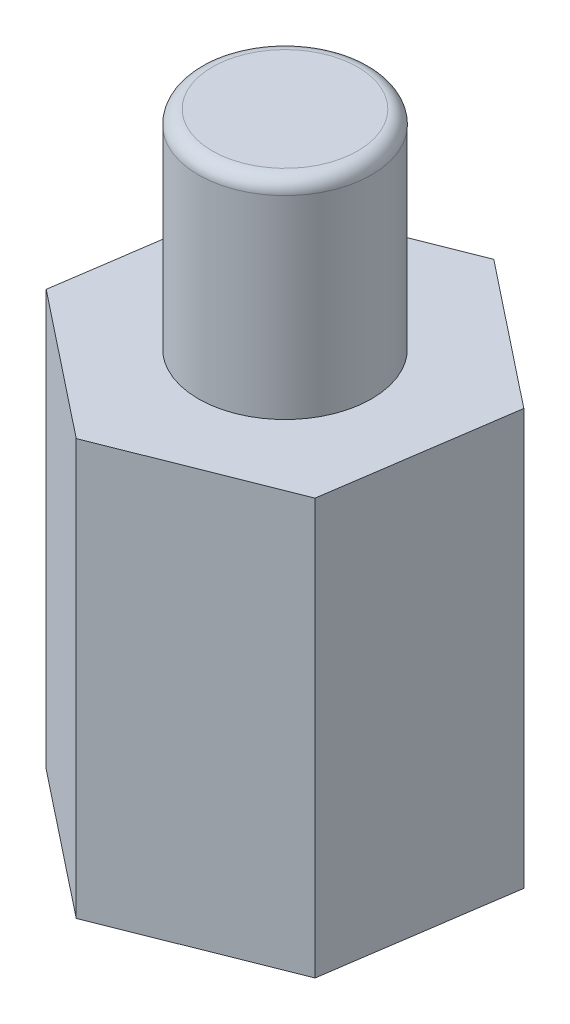
ISO-10303-21;
HEADER;
FILE_DESCRIPTION(('STEP AP214'),'2;1');
FILE_NAME('part.step','',(''),(''),'','','');
FILE_SCHEMA(('AUTOMOTIVE_DESIGN { 1 0 10303 214 1 1 1 1 }'));
ENDSEC;
DATA;
#1=APPLICATION_CONTEXT('core data for automotive mechanical design processes');
#2=APPLICATION_PROTOCOL_DEFINITION('international standard','automotive_design',2000,#1);
#3=PRODUCT_CONTEXT('',#1,'mechanical');
#4=PRODUCT('Part','Part','',(#3));
#5=PRODUCT_RELATED_PRODUCT_CATEGORY('part','',(#4));
#6=PRODUCT_DEFINITION_FORMATION('','',#4);
#7=PRODUCT_DEFINITION_CONTEXT('part definition',#1,'design');
#8=PRODUCT_DEFINITION('design','',#6,#7);
#9=PRODUCT_DEFINITION_SHAPE('','',#8);
#10=(LENGTH_UNIT() NAMED_UNIT(*) SI_UNIT(.MILLI.,.METRE.));
#11=(NAMED_UNIT(*) PLANE_ANGLE_UNIT() SI_UNIT($,.RADIAN.));
#12=(NAMED_UNIT(*) SI_UNIT($,.STERADIAN.) SOLID_ANGLE_UNIT());
#13=UNCERTAINTY_MEASURE_WITH_UNIT(LENGTH_MEASURE(1.E-05),#10,'distance_accuracy_value','');
#14=(GEOMETRIC_REPRESENTATION_CONTEXT(3) GLOBAL_UNCERTAINTY_ASSIGNED_CONTEXT((#13)) GLOBAL_UNIT_ASSIGNED_CONTEXT((#10,
#11,#12)) REPRESENTATION_CONTEXT('',''));
#15=CARTESIAN_POINT('',(0.,0.,0.));
#16=DIRECTION('',(0.,0.,1.));
#17=DIRECTION('',(1.,0.,0.));
#18=AXIS2_PLACEMENT_3D('',#15,#16,#17);
#19=CARTESIAN_POINT('',(-0.386477916077778,6.,2.62754032389945));
#20=DIRECTION('',(-0.368652129532225,0.,-0.929567430255253));
#21=DIRECTION('',(-0.929567430255254,0.,0.368652129532225));
#22=AXIS2_PLACEMENT_3D('',#19,#20,#21);
#23=PLANE('',#22);
#24=DIRECTION('',(0.929567430255254,0.,-0.368652129532225));
#25=VECTOR('',#24,1.);
#26=CARTESIAN_POINT('',(-0.386477916077778,0.,2.62754032389945));
#27=LINE('',#26,#25);
#28=CARTESIAN_POINT('',(-0.386477916077778,0.,2.62754032389945));
#29=VERTEX_POINT('',#28);
#30=CARTESIAN_POINT('',(2.08227771192603,0.,1.64846985527475));
#31=VERTEX_POINT('',#30);
#32=EDGE_CURVE('E119',#29,#31,#27,.T.);
#33=ORIENTED_EDGE('',*,*,#32,.T.);
#34=DIRECTION('',(0.,-1.,0.));
#35=VECTOR('',#34,1.);
#36=CARTESIAN_POINT('',(2.08227771192603,6.,1.64846985527475));
#37=LINE('',#36,#35);
#38=CARTESIAN_POINT('',(2.08227771192603,6.,1.64846985527475));
#39=VERTEX_POINT('',#38);
#40=EDGE_CURVE('E137',#39,#31,#37,.T.);
#41=ORIENTED_EDGE('',*,*,#40,.F.);
#42=DIRECTION('',(0.929567430255254,0.,-0.368652129532225));
#43=VECTOR('',#42,1.);
#44=CARTESIAN_POINT('',(-0.386477916077778,6.,2.62754032389945));
#45=LINE('',#44,#43);
#46=CARTESIAN_POINT('',(-0.386477916077778,6.,2.62754032389945));
#47=VERTEX_POINT('',#46);
#48=EDGE_CURVE('E130',#47,#39,#45,.T.);
#49=ORIENTED_EDGE('',*,*,#48,.F.);
#50=DIRECTION('',(0.,-1.,0.));
#51=VECTOR('',#50,1.);
#52=CARTESIAN_POINT('',(-0.386477916077778,6.,2.62754032389945));
#53=LINE('',#52,#51);
#54=EDGE_CURVE('E115',#47,#29,#53,.T.);
#55=ORIENTED_EDGE('',*,*,#54,.T.);
#56=EDGE_LOOP('',(#33,#41,#49,#55));
#57=FACE_BOUND('',#56,.T.);
#58=ADVANCED_FACE('F33',(#57),#23,.F.);
#59=CARTESIAN_POINT('',(2.08227771192603,6.,1.64846985527475));
#60=DIRECTION('',(-0.989355073897781,0.,-0.145521605793488));
#61=DIRECTION('',(-0.145521605793488,0.,0.989355073897781));
#62=AXIS2_PLACEMENT_3D('',#59,#60,#61);
#63=PLANE('',#62);
#64=DIRECTION('',(0.145521605793488,0.,-0.989355073897781));
#65=VECTOR('',#64,1.);
#66=CARTESIAN_POINT('',(2.08227771192603,0.,1.64846985527475));
#67=LINE('',#66,#65);
#68=CARTESIAN_POINT('',(2.46875562800381,0.,-0.9790704686247));
#69=VERTEX_POINT('',#68);
#70=EDGE_CURVE('E122',#31,#69,#67,.T.);
#71=ORIENTED_EDGE('',*,*,#70,.T.);
#72=DIRECTION('',(0.,-1.,0.));
#73=VECTOR('',#72,1.);
#74=CARTESIAN_POINT('',(2.46875562800381,6.,-0.9790704686247));
#75=LINE('',#74,#73);
#76=CARTESIAN_POINT('',(2.46875562800381,6.,-0.9790704686247));
#77=VERTEX_POINT('',#76);
#78=EDGE_CURVE('E134',#77,#69,#75,.T.);
#79=ORIENTED_EDGE('',*,*,#78,.F.);
#80=DIRECTION('',(0.145521605793488,0.,-0.989355073897781));
#81=VECTOR('',#80,1.);
#82=CARTESIAN_POINT('',(2.08227771192603,6.,1.64846985527475));
#83=LINE('',#82,#81);
#84=EDGE_CURVE('E88',#39,#77,#83,.T.);
#85=ORIENTED_EDGE('',*,*,#84,.F.);
#86=ORIENTED_EDGE('',*,*,#40,.T.);
#87=EDGE_LOOP('',(#71,#79,#85,#86));
#88=FACE_BOUND('',#87,.T.);
#89=ADVANCED_FACE('F153',(#88),#63,.F.);
#90=CARTESIAN_POINT('',(2.46875562800381,6.,-0.9790704686247));
#91=DIRECTION('',(-0.620702944365557,0.,0.784045824461765));
#92=DIRECTION('',(0.784045824461765,0.,0.620702944365557));
#93=AXIS2_PLACEMENT_3D('',#90,#91,#92);
#94=PLANE('',#93);
#95=DIRECTION('',(-0.784045824461765,0.,-0.620702944365557));
#96=VECTOR('',#95,1.);
#97=CARTESIAN_POINT('',(2.46875562800381,0.,-0.9790704686247));
#98=LINE('',#97,#96);
#99=CARTESIAN_POINT('',(0.386477916077779,0.,-2.62754032389945));
#100=VERTEX_POINT('',#99);
#101=EDGE_CURVE('E125',#69,#100,#98,.T.);
#102=ORIENTED_EDGE('',*,*,#101,.T.);
#103=DIRECTION('',(0.,-1.,0.));
#104=VECTOR('',#103,1.);
#105=CARTESIAN_POINT('',(0.386477916077779,6.,-2.62754032389945));
#106=LINE('',#105,#104);
#107=CARTESIAN_POINT('',(0.386477916077779,6.,-2.62754032389945));
#108=VERTEX_POINT('',#107);
#109=EDGE_CURVE('E110',#108,#100,#106,.T.);
#110=ORIENTED_EDGE('',*,*,#109,.F.);
#111=DIRECTION('',(-0.784045824461765,0.,-0.620702944365557));
#112=VECTOR('',#111,1.);
#113=CARTESIAN_POINT('',(2.46875562800381,6.,-0.9790704686247));
#114=LINE('',#113,#112);
#115=EDGE_CURVE('E101',#77,#108,#114,.T.);
#116=ORIENTED_EDGE('',*,*,#115,.F.);
#117=ORIENTED_EDGE('',*,*,#78,.T.);
#118=EDGE_LOOP('',(#102,#110,#116,#117));
#119=FACE_BOUND('',#118,.T.);
#120=ADVANCED_FACE('F156',(#119),#94,.F.);
#121=CARTESIAN_POINT('',(0.386477916077779,6.,-2.62754032389945));
#122=DIRECTION('',(0.368652129532225,0.,0.929567430255253));
#123=DIRECTION('',(0.929567430255254,0.,-0.368652129532225));
#124=AXIS2_PLACEMENT_3D('',#121,#122,#123);
#125=PLANE('',#124);
#126=DIRECTION('',(-0.929567430255254,0.,0.368652129532225));
#127=VECTOR('',#126,1.);
#128=CARTESIAN_POINT('',(0.386477916077779,0.,-2.62754032389945));
#129=LINE('',#128,#127);
#130=CARTESIAN_POINT('',(-2.08227771192603,0.,-1.64846985527475));
#131=VERTEX_POINT('',#130);
#132=EDGE_CURVE('E109',#100,#131,#129,.T.);
#133=ORIENTED_EDGE('',*,*,#132,.T.);
#134=DIRECTION('',(0.,-1.,0.));
#135=VECTOR('',#134,1.);
#136=CARTESIAN_POINT('',(-2.08227771192603,6.,-1.64846985527475));
#137=LINE('',#136,#135);
#138=CARTESIAN_POINT('',(-2.08227771192603,6.,-1.64846985527475));
#139=VERTEX_POINT('',#138);
#140=EDGE_CURVE('E106',#139,#131,#137,.T.);
#141=ORIENTED_EDGE('',*,*,#140,.F.);
#142=DIRECTION('',(-0.929567430255254,0.,0.368652129532225));
#143=VECTOR('',#142,1.);
#144=CARTESIAN_POINT('',(0.386477916077779,6.,-2.62754032389945));
#145=LINE('',#144,#143);
#146=EDGE_CURVE('E95',#108,#139,#145,.T.);
#147=ORIENTED_EDGE('',*,*,#146,.F.);
#148=ORIENTED_EDGE('',*,*,#109,.T.);
#149=EDGE_LOOP('',(#133,#141,#147,#148));
#150=FACE_BOUND('',#149,.T.);
#151=ADVANCED_FACE('F107',(#150),#125,.F.);
#152=CARTESIAN_POINT('',(-2.08227771192603,6.,-1.64846985527475));
#153=DIRECTION('',(0.989355073897781,0.,0.145521605793488));
#154=DIRECTION('',(0.145521605793488,0.,-0.989355073897782));
#155=AXIS2_PLACEMENT_3D('',#152,#153,#154);
#156=PLANE('',#155);
#157=DIRECTION('',(-0.145521605793488,0.,0.989355073897782));
#158=VECTOR('',#157,1.);
#159=CARTESIAN_POINT('',(-2.08227771192603,0.,-1.64846985527475));
#160=LINE('',#159,#158);
#161=CARTESIAN_POINT('',(-2.46875562800381,0.,0.9790704686247));
#162=VERTEX_POINT('',#161);
#163=EDGE_CURVE('E73',#131,#162,#160,.T.);
#164=ORIENTED_EDGE('',*,*,#163,.T.);
#165=DIRECTION('',(0.,-1.,0.));
#166=VECTOR('',#165,1.);
#167=CARTESIAN_POINT('',(-2.46875562800381,6.,0.9790704686247));
#168=LINE('',#167,#166);
#169=CARTESIAN_POINT('',(-2.46875562800381,6.,0.9790704686247));
#170=VERTEX_POINT('',#169);
#171=EDGE_CURVE('E111',#170,#162,#168,.T.);
#172=ORIENTED_EDGE('',*,*,#171,.F.);
#173=DIRECTION('',(-0.145521605793488,0.,0.989355073897782));
#174=VECTOR('',#173,1.);
#175=CARTESIAN_POINT('',(-2.08227771192603,6.,-1.64846985527475));
#176=LINE('',#175,#174);
#177=EDGE_CURVE('E99',#139,#170,#176,.T.);
#178=ORIENTED_EDGE('',*,*,#177,.F.);
#179=ORIENTED_EDGE('',*,*,#140,.T.);
#180=EDGE_LOOP('',(#164,#172,#178,#179));
#181=FACE_BOUND('',#180,.T.);
#182=ADVANCED_FACE('F113',(#181),#156,.F.);
#183=CARTESIAN_POINT('',(-2.46875562800381,6.,0.9790704686247));
#184=DIRECTION('',(0.620702944365556,0.,-0.784045824461765));
#185=DIRECTION('',(-0.784045824461765,0.,-0.620702944365556));
#186=AXIS2_PLACEMENT_3D('',#183,#184,#185);
#187=PLANE('',#186);
#188=DIRECTION('',(0.784045824461765,0.,0.620702944365556));
#189=VECTOR('',#188,1.);
#190=CARTESIAN_POINT('',(-2.46875562800381,0.,0.9790704686247));
#191=LINE('',#190,#189);
#192=EDGE_CURVE('E79',#162,#29,#191,.T.);
#193=ORIENTED_EDGE('',*,*,#192,.T.);
#194=ORIENTED_EDGE('',*,*,#54,.F.);
#195=DIRECTION('',(0.784045824461765,0.,0.620702944365556));
#196=VECTOR('',#195,1.);
#197=CARTESIAN_POINT('',(-2.46875562800381,6.,0.9790704686247));
#198=LINE('',#197,#196);
#199=EDGE_CURVE('E50',#170,#47,#198,.T.);
#200=ORIENTED_EDGE('',*,*,#199,.F.);
#201=ORIENTED_EDGE('',*,*,#171,.T.);
#202=EDGE_LOOP('',(#193,#194,#200,#201));
#203=FACE_BOUND('',#202,.T.);
#204=ADVANCED_FACE('F161',(#203),#187,.F.);
#205=CARTESIAN_POINT('',(0.,6.,0.));
#206=DIRECTION('',(0.,1.,0.));
#207=DIRECTION('',(0.,0.,1.));
#208=AXIS2_PLACEMENT_3D('',#205,#206,#207);
#209=PLANE('',#208);
#210=CARTESIAN_POINT('',(0.,6.,0.));
#211=DIRECTION('',(0.,1.,0.));
#212=DIRECTION('',(0.,0.,1.));
#213=AXIS2_PLACEMENT_3D('',#210,#211,#212);
#214=CIRCLE('',#213,1.25);
#215=CARTESIAN_POINT('',(0.,6.,1.25));
#216=VERTEX_POINT('',#215);
#217=EDGE_CURVE('E138',#216,#216,#214,.T.);
#218=ORIENTED_EDGE('',*,*,#217,.F.);
#219=EDGE_LOOP('',(#218));
#220=FACE_BOUND('',#219,.T.);
#221=ORIENTED_EDGE('',*,*,#48,.T.);
#222=ORIENTED_EDGE('',*,*,#84,.T.);
#223=ORIENTED_EDGE('',*,*,#115,.T.);
#224=ORIENTED_EDGE('',*,*,#146,.T.);
#225=ORIENTED_EDGE('',*,*,#177,.T.);
#226=ORIENTED_EDGE('',*,*,#199,.T.);
#227=EDGE_LOOP('',(#221,#222,#223,#224,#225,#226));
#228=FACE_BOUND('',#227,.T.);
#229=ADVANCED_FACE('F97',(#220,#228),#209,.T.);
#230=CARTESIAN_POINT('',(0.,0.,0.));
#231=DIRECTION('',(0.,1.,0.));
#232=DIRECTION('',(0.,0.,1.));
#233=AXIS2_PLACEMENT_3D('',#230,#231,#232);
#234=PLANE('',#233);
#235=CARTESIAN_POINT('',(0.,0.,0.));
#236=DIRECTION('',(0.,-1.,0.));
#237=DIRECTION('',(0.,0.,-1.));
#238=AXIS2_PLACEMENT_3D('',#235,#236,#237);
#239=CIRCLE('',#238,1.25);
#240=CARTESIAN_POINT('',(0.,0.,-1.25));
#241=VERTEX_POINT('',#240);
#242=EDGE_CURVE('E148',#241,#241,#239,.T.);
#243=ORIENTED_EDGE('',*,*,#242,.F.);
#244=EDGE_LOOP('',(#243));
#245=FACE_BOUND('',#244,.T.);
#246=ORIENTED_EDGE('',*,*,#32,.F.);
#247=ORIENTED_EDGE('',*,*,#192,.F.);
#248=ORIENTED_EDGE('',*,*,#163,.F.);
#249=ORIENTED_EDGE('',*,*,#132,.F.);
#250=ORIENTED_EDGE('',*,*,#101,.F.);
#251=ORIENTED_EDGE('',*,*,#70,.F.);
#252=EDGE_LOOP('',(#246,#247,#248,#249,#250,#251));
#253=FACE_BOUND('',#252,.T.);
#254=ADVANCED_FACE('F159',(#245,#253),#234,.F.);
#255=CARTESIAN_POINT('',(0.,9.,0.));
#256=DIRECTION('',(0.,-1.,0.));
#257=DIRECTION('',(0.,0.,-1.));
#258=AXIS2_PLACEMENT_3D('',#255,#256,#257);
#259=CYLINDRICAL_SURFACE('',#258,1.25);
#260=CARTESIAN_POINT('',(0.,8.8,0.));
#261=DIRECTION('',(0.,1.,0.));
#262=DIRECTION('',(0.,0.,1.));
#263=AXIS2_PLACEMENT_3D('',#260,#261,#262);
#264=CIRCLE('',#263,1.25);
#265=CARTESIAN_POINT('',(0.,8.8,1.25));
#266=VERTEX_POINT('',#265);
#267=EDGE_CURVE('E11',#266,#266,#264,.F.);
#268=ORIENTED_EDGE('',*,*,#267,.T.);
#269=EDGE_LOOP('',(#268));
#270=FACE_BOUND('',#269,.T.);
#271=ORIENTED_EDGE('',*,*,#217,.T.);
#272=EDGE_LOOP('',(#271));
#273=FACE_BOUND('',#272,.T.);
#274=ADVANCED_FACE('F206',(#270,#273),#259,.T.);
#275=CARTESIAN_POINT('',(0.,9.,0.));
#276=DIRECTION('',(0.,1.,0.));
#277=DIRECTION('',(0.,0.,1.));
#278=AXIS2_PLACEMENT_3D('',#275,#276,#277);
#279=PLANE('',#278);
#280=CARTESIAN_POINT('',(0.,9.,0.));
#281=DIRECTION('',(0.,1.,0.));
#282=DIRECTION('',(0.,0.,1.));
#283=AXIS2_PLACEMENT_3D('',#280,#281,#282);
#284=CIRCLE('',#283,1.05);
#285=CARTESIAN_POINT('',(0.,9.,1.05));
#286=VERTEX_POINT('',#285);
#287=EDGE_CURVE('E42',#286,#286,#284,.T.);
#288=ORIENTED_EDGE('',*,*,#287,.T.);
#289=EDGE_LOOP('',(#288));
#290=FACE_BOUND('',#289,.T.);
#291=ADVANCED_FACE('F211',(#290),#279,.T.);
#292=CARTESIAN_POINT('',(0.,8.8,0.));
#293=DIRECTION('',(0.,1.,0.));
#294=DIRECTION('',(0.,0.,1.));
#295=AXIS2_PLACEMENT_3D('',#292,#293,#294);
#296=TOROIDAL_SURFACE('',#295,1.05,0.2);
#297=ORIENTED_EDGE('',*,*,#267,.F.);
#298=EDGE_LOOP('',(#297));
#299=FACE_BOUND('',#298,.T.);
#300=ORIENTED_EDGE('',*,*,#287,.F.);
#301=EDGE_LOOP('',(#300));
#302=FACE_BOUND('',#301,.T.);
#303=ADVANCED_FACE('F35',(#299,#302),#296,.T.);
#304=CARTESIAN_POINT('',(0.,3.,0.));
#305=DIRECTION('',(0.,-1.,0.));
#306=DIRECTION('',(0.,0.,-1.));
#307=AXIS2_PLACEMENT_3D('',#304,#305,#306);
#308=CYLINDRICAL_SURFACE('',#307,1.25);
#309=CARTESIAN_POINT('',(0.,3.,0.));
#310=DIRECTION('',(0.,-1.,0.));
#311=DIRECTION('',(0.,0.,-1.));
#312=AXIS2_PLACEMENT_3D('',#309,#310,#311);
#313=CIRCLE('',#312,1.25);
#314=CARTESIAN_POINT('',(0.,3.,-1.25));
#315=VERTEX_POINT('',#314);
#316=EDGE_CURVE('E123',#315,#315,#313,.T.);
#317=ORIENTED_EDGE('',*,*,#316,.F.);
#318=EDGE_LOOP('',(#317));
#319=FACE_BOUND('',#318,.T.);
#320=ORIENTED_EDGE('',*,*,#242,.T.);
#321=EDGE_LOOP('',(#320));
#322=FACE_BOUND('',#321,.T.);
#323=ADVANCED_FACE('F229',(#319,#322),#308,.F.);
#324=CARTESIAN_POINT('',(0.,3.,0.));
#325=DIRECTION('',(0.,-1.,0.));
#326=DIRECTION('',(0.,0.,-1.));
#327=AXIS2_PLACEMENT_3D('',#324,#325,#326);
#328=PLANE('',#327);
#329=ORIENTED_EDGE('',*,*,#316,.T.);
#330=EDGE_LOOP('',(#329));
#331=FACE_BOUND('',#330,.T.);
#332=ADVANCED_FACE('F244',(#331),#328,.T.);
#333=CLOSED_SHELL('',(#58,#89,#120,#151,#182,#204,#229,#254,#274,#291,#303,#323,#332));
#334=MANIFOLD_SOLID_BREP('B2',#333);
#335=ADVANCED_BREP_SHAPE_REPRESENTATION('',(#18,#334),#14);
#336=SHAPE_DEFINITION_REPRESENTATION(#9,#335);
ENDSEC;
END-ISO-10303-21;
